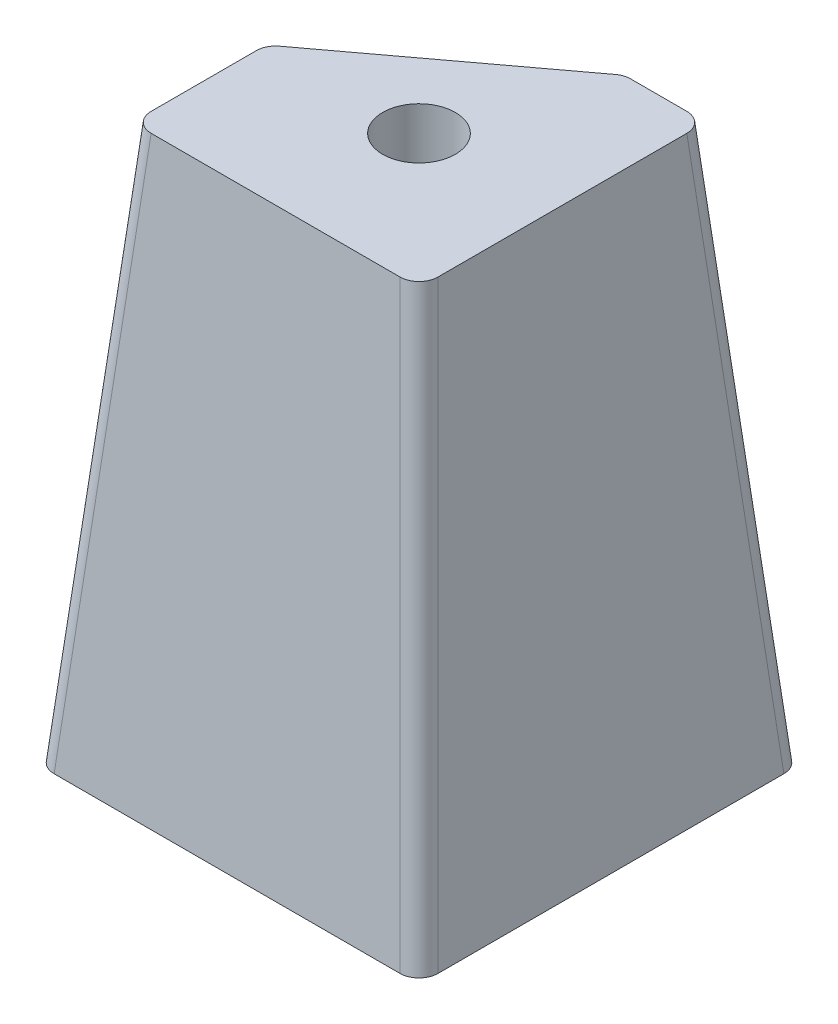
ISO-10303-21;
HEADER;
FILE_DESCRIPTION(('STEP AP214'),'2;1');
FILE_NAME('part.step','',(''),(''),'','','');
FILE_SCHEMA(('AUTOMOTIVE_DESIGN { 1 0 10303 214 1 1 1 1 }'));
ENDSEC;
DATA;
#1=APPLICATION_CONTEXT('core data for automotive mechanical design processes');
#2=APPLICATION_PROTOCOL_DEFINITION('international standard','automotive_design',2000,#1);
#3=PRODUCT_CONTEXT('',#1,'mechanical');
#4=PRODUCT('Part','Part','',(#3));
#5=PRODUCT_RELATED_PRODUCT_CATEGORY('part','',(#4));
#6=PRODUCT_DEFINITION_FORMATION('','',#4);
#7=PRODUCT_DEFINITION_CONTEXT('part definition',#1,'design');
#8=PRODUCT_DEFINITION('design','',#6,#7);
#9=PRODUCT_DEFINITION_SHAPE('','',#8);
#10=(LENGTH_UNIT() NAMED_UNIT(*) SI_UNIT(.MILLI.,.METRE.));
#11=(NAMED_UNIT(*) PLANE_ANGLE_UNIT() SI_UNIT($,.RADIAN.));
#12=(NAMED_UNIT(*) SI_UNIT($,.STERADIAN.) SOLID_ANGLE_UNIT());
#13=UNCERTAINTY_MEASURE_WITH_UNIT(LENGTH_MEASURE(1.E-05),#10,'distance_accuracy_value','');
#14=(GEOMETRIC_REPRESENTATION_CONTEXT(3) GLOBAL_UNCERTAINTY_ASSIGNED_CONTEXT((#13)) GLOBAL_UNIT_ASSIGNED_CONTEXT((#10,
#11,#12)) REPRESENTATION_CONTEXT('',''));
#15=CARTESIAN_POINT('',(0.,0.,0.));
#16=DIRECTION('',(0.,0.,1.));
#17=DIRECTION('',(1.,0.,0.));
#18=AXIS2_PLACEMENT_3D('',#15,#16,#17);
#19=CARTESIAN_POINT('',(-4.57964601769912,29.,7.20132743362832));
#20=DIRECTION('',(-0.996194698091746,0.0871557427476584,0.));
#21=DIRECTION('',(0.0871557427476584,0.996194698091746,0.));
#22=AXIS2_PLACEMENT_3D('',#19,#20,#21);
#23=PLANE('',#22);
#24=DIRECTION('',(0.,0.,1.));
#25=VECTOR('',#24,1.);
#26=CARTESIAN_POINT('',(-4.57964601769912,29.,7.20132743362832));
#27=LINE('',#26,#25);
#28=CARTESIAN_POINT('',(-4.57964601769912,29.,0.701272397167981));
#29=VERTEX_POINT('',#28);
#30=CARTESIAN_POINT('',(-4.57964601769912,29.,6.20513273553657));
#31=VERTEX_POINT('',#30);
#32=EDGE_CURVE('E152',#29,#31,#27,.T.);
#33=ORIENTED_EDGE('',*,*,#32,.F.);
#34=DIRECTION('',(0.0870724913818913,0.995243130626751,0.0436977366097345));
#35=VECTOR('',#34,1.);
#36=CARTESIAN_POINT('',(-4.55491414812916,29.2826865627297,0.713684201460962));
#37=LINE('',#36,#35);
#38=CARTESIAN_POINT('',(-7.11681725995092,0.,-0.572018844625635));
#39=VERTEX_POINT('',#38);
#40=EDGE_CURVE('E201',#29,#39,#37,.F.);
#41=ORIENTED_EDGE('',*,*,#40,.T.);
#42=DIRECTION('',(0.,0.,-1.));
#43=VECTOR('',#42,1.);
#44=CARTESIAN_POINT('',(-7.11681725995092,0.,0.));
#45=LINE('',#44,#43);
#46=CARTESIAN_POINT('',(-7.11681725995092,0.,8.74230397778837));
#47=VERTEX_POINT('',#46);
#48=EDGE_CURVE('E164',#39,#47,#45,.F.);
#49=ORIENTED_EDGE('',*,*,#48,.T.);
#50=DIRECTION('',(0.0868265938642478,0.992432509138967,-0.0868265938642478));
#51=VECTOR('',#50,1.);
#52=CARTESIAN_POINT('',(-4.58715618747273,28.914158366685,6.21264290531018));
#53=LINE('',#52,#51);
#54=EDGE_CURVE('E198',#47,#31,#53,.T.);
#55=ORIENTED_EDGE('',*,*,#54,.T.);
#56=EDGE_LOOP('',(#33,#41,#49,#55));
#57=FACE_BOUND('',#56,.T.);
#58=ADVANCED_FACE('F43',(#57),#23,.T.);
#59=CARTESIAN_POINT('',(10.4203539823009,29.,7.20132743362832));
#60=DIRECTION('',(0.,0.0871557427476584,0.996194698091746));
#61=DIRECTION('',(0.,0.996194698091746,-0.0871557427476584));
#62=AXIS2_PLACEMENT_3D('',#59,#60,#61);
#63=PLANE('',#62);
#64=DIRECTION('',(-1.,0.,0.));
#65=VECTOR('',#64,1.);
#66=CARTESIAN_POINT('',(0.,0.,9.73849867588012));
#67=LINE('',#66,#65);
#68=CARTESIAN_POINT('',(-6.12062256185918,0.,9.73849867588012));
#69=VERTEX_POINT('',#68);
#70=CARTESIAN_POINT('',(11.9613305264609,0.,9.73849867588012));
#71=VERTEX_POINT('',#70);
#72=EDGE_CURVE('E218',#69,#71,#67,.F.);
#73=ORIENTED_EDGE('',*,*,#72,.T.);
#74=DIRECTION('',(-0.0868265938642478,0.992432509138967,-0.0868265938642478));
#75=VECTOR('',#74,1.);
#76=CARTESIAN_POINT('',(9.43166945398275,28.914158366685,7.20883760340192));
#77=LINE('',#76,#75);
#78=CARTESIAN_POINT('',(9.42415928420914,29.,7.20132743362832));
#79=VERTEX_POINT('',#78);
#80=EDGE_CURVE('E11',#71,#79,#77,.T.);
#81=ORIENTED_EDGE('',*,*,#80,.T.);
#82=DIRECTION('',(1.,0.,0.));
#83=VECTOR('',#82,1.);
#84=CARTESIAN_POINT('',(10.4203539823009,29.,7.20132743362832));
#85=LINE('',#84,#83);
#86=CARTESIAN_POINT('',(-3.58345131960737,29.,7.20132743362832));
#87=VERTEX_POINT('',#86);
#88=EDGE_CURVE('E158',#87,#79,#85,.T.);
#89=ORIENTED_EDGE('',*,*,#88,.F.);
#90=DIRECTION('',(0.0868265938642478,0.992432509138967,-0.0868265938642478));
#91=VECTOR('',#90,1.);
#92=CARTESIAN_POINT('',(-3.47787862834998,30.2067013828153,7.09575474237092));
#93=LINE('',#92,#91);
#94=EDGE_CURVE('E55',#87,#69,#93,.F.);
#95=ORIENTED_EDGE('',*,*,#94,.T.);
#96=EDGE_LOOP('',(#73,#81,#89,#95));
#97=FACE_BOUND('',#96,.T.);
#98=ADVANCED_FACE('F220',(#97),#63,.T.);
#99=CARTESIAN_POINT('',(10.4203539823009,29.,-7.79867256637168));
#100=DIRECTION('',(0.996194698091746,0.0871557427476584,0.));
#101=DIRECTION('',(-0.0871557427476584,0.996194698091746,0.));
#102=AXIS2_PLACEMENT_3D('',#99,#100,#101);
#103=PLANE('',#102);
#104=DIRECTION('',(0.,0.,1.));
#105=VECTOR('',#104,1.);
#106=CARTESIAN_POINT('',(12.9575252245527,0.,0.));
#107=LINE('',#106,#105);
#108=CARTESIAN_POINT('',(12.9575252245527,0.,8.74230397778837));
#109=VERTEX_POINT('',#108);
#110=CARTESIAN_POINT('',(12.9575252245527,0.,-9.33964911053174));
#111=VERTEX_POINT('',#110);
#112=EDGE_CURVE('E163',#109,#111,#107,.F.);
#113=ORIENTED_EDGE('',*,*,#112,.T.);
#114=DIRECTION('',(-0.0868265938642478,0.992432509138967,0.0868265938642478));
#115=VECTOR('',#114,1.);
#116=CARTESIAN_POINT('',(10.4278641520745,28.914158366685,-6.80998803805355));
#117=LINE('',#116,#115);
#118=CARTESIAN_POINT('',(10.4203539823009,29.,-6.80247786827994));
#119=VERTEX_POINT('',#118);
#120=EDGE_CURVE('E56',#111,#119,#117,.T.);
#121=ORIENTED_EDGE('',*,*,#120,.T.);
#122=DIRECTION('',(0.,0.,-1.));
#123=VECTOR('',#122,1.);
#124=CARTESIAN_POINT('',(10.4203539823009,29.,-7.79867256637168));
#125=LINE('',#124,#123);
#126=CARTESIAN_POINT('',(10.4203539823009,29.,6.20513273553657));
#127=VERTEX_POINT('',#126);
#128=EDGE_CURVE('E232',#127,#119,#125,.T.);
#129=ORIENTED_EDGE('',*,*,#128,.F.);
#130=DIRECTION('',(-0.0868265938642478,0.992432509138967,-0.0868265938642478));
#131=VECTOR('',#130,1.);
#132=CARTESIAN_POINT('',(10.3147812910435,30.2067013828153,6.09956004427917));
#133=LINE('',#132,#131);
#134=EDGE_CURVE('E204',#127,#109,#133,.F.);
#135=ORIENTED_EDGE('',*,*,#134,.T.);
#136=EDGE_LOOP('',(#113,#121,#129,#135));
#137=FACE_BOUND('',#136,.T.);
#138=ADVANCED_FACE('F285',(#137),#103,.T.);
#139=CARTESIAN_POINT('',(6.15317736901956,29.,-7.79867256637168));
#140=DIRECTION('',(0.,0.0871557427476584,-0.996194698091746));
#141=DIRECTION('',(0.,0.996194698091746,0.0871557427476584));
#142=AXIS2_PLACEMENT_3D('',#139,#140,#141);
#143=PLANE('',#142);
#144=DIRECTION('',(1.,0.,0.));
#145=VECTOR('',#144,1.);
#146=CARTESIAN_POINT('',(0.,0.,-10.3358438086235));
#147=LINE('',#146,#145);
#148=CARTESIAN_POINT('',(11.9613305264609,0.,-10.3358438086235));
#149=VERTEX_POINT('',#148);
#150=CARTESIAN_POINT('',(5.64205583364326,0.,-10.3358438086235));
#151=VERTEX_POINT('',#150);
#152=EDGE_CURVE('E155',#149,#151,#147,.F.);
#153=ORIENTED_EDGE('',*,*,#152,.T.);
#154=DIRECTION('',(0.0288963352029625,0.995778700850393,0.087119347704982));
#155=VECTOR('',#154,1.);
#156=CARTESIAN_POINT('',(6.48332606858436,28.9904922451157,-7.79950438713965));
#157=LINE('',#156,#155);
#158=CARTESIAN_POINT('',(6.48360197252961,29.,-7.79867256637168));
#159=VERTEX_POINT('',#158);
#160=EDGE_CURVE('E130',#151,#159,#157,.T.);
#161=ORIENTED_EDGE('',*,*,#160,.T.);
#162=DIRECTION('',(-1.,0.,0.));
#163=VECTOR('',#162,1.);
#164=CARTESIAN_POINT('',(6.15317736901956,29.,-7.79867256637168));
#165=LINE('',#164,#163);
#166=CARTESIAN_POINT('',(9.42415928420914,29.,-7.79867256637168));
#167=VERTEX_POINT('',#166);
#168=EDGE_CURVE('E233',#167,#159,#165,.T.);
#169=ORIENTED_EDGE('',*,*,#168,.F.);
#170=DIRECTION('',(-0.0868265938642478,0.992432509138967,0.0868265938642478));
#171=VECTOR('',#170,1.);
#172=CARTESIAN_POINT('',(9.39949981798578,29.2818589886911,-7.77401310014833));
#173=LINE('',#172,#171);
#174=EDGE_CURVE('E133',#167,#149,#173,.F.);
#175=ORIENTED_EDGE('',*,*,#174,.T.);
#176=EDGE_LOOP('',(#153,#161,#169,#175));
#177=FACE_BOUND('',#176,.T.);
#178=ADVANCED_FACE('F276',(#177),#143,.T.);
#179=CARTESIAN_POINT('',(-4.57964601769912,29.,0.201327433628318));
#180=DIRECTION('',(-0.595351002863313,0.0871557427476584,-0.798724645854723));
#181=DIRECTION('',(0.0520864635693299,0.996194698091746,0.0698793517910468));
#182=AXIS2_PLACEMENT_3D('',#179,#180,#181);
#183=PLANE('',#182);
#184=DIRECTION('',(-0.801775644243755,0.,0.59762514697552));
#185=VECTOR('',#184,1.);
#186=CARTESIAN_POINT('',(-4.57964601769912,29.,0.201327433628318));
#187=LINE('',#186,#185);
#188=CARTESIAN_POINT('',(5.8882509696663,29.,-7.60120251413466));
#189=VERTEX_POINT('',#188);
#190=CARTESIAN_POINT('',(-4.17880232247069,29.,-0.0974522486867427));
#191=VERTEX_POINT('',#190);
#192=EDGE_CURVE('E141',#189,#191,#187,.T.);
#193=ORIENTED_EDGE('',*,*,#192,.F.);
#194=DIRECTION('',(0.0288963352029625,0.995778700850393,0.087119347704982));
#195=VECTOR('',#194,1.);
#196=CARTESIAN_POINT('',(5.89915261663084,29.3756749004757,-7.56833521917181));
#197=LINE('',#196,#195);
#198=CARTESIAN_POINT('',(5.04670483077995,0.,-10.1383737563865));
#199=VERTEX_POINT('',#198);
#200=EDGE_CURVE('E127',#189,#199,#197,.F.);
#201=ORIENTED_EDGE('',*,*,#200,.T.);
#202=DIRECTION('',(0.801775644243755,0.,-0.59762514697552));
#203=VECTOR('',#202,1.);
#204=CARTESIAN_POINT('',(-3.0554562361052,0.,-4.09920901849566));
#205=LINE('',#204,#203);
#206=CARTESIAN_POINT('',(-6.71597356472249,0.,-1.37074349048036));
#207=VERTEX_POINT('',#206);
#208=EDGE_CURVE('E139',#199,#207,#205,.F.);
#209=ORIENTED_EDGE('',*,*,#208,.T.);
#210=DIRECTION('',(0.0870724913818913,0.995243130626751,0.0436977366097345));
#211=VECTOR('',#210,1.);
#212=CARTESIAN_POINT('',(-4.18070454846125,28.9782574574362,-0.0984068896874585));
#213=LINE('',#212,#211);
#214=EDGE_CURVE('E147',#207,#191,#213,.T.);
#215=ORIENTED_EDGE('',*,*,#214,.T.);
#216=EDGE_LOOP('',(#193,#201,#209,#215));
#217=FACE_BOUND('',#216,.T.);
#218=ADVANCED_FACE('F137',(#217),#183,.T.);
#219=CARTESIAN_POINT('',(0.,29.,0.));
#220=DIRECTION('',(0.,-1.,0.));
#221=DIRECTION('',(0.,0.,-1.));
#222=AXIS2_PLACEMENT_3D('',#219,#220,#221);
#223=PLANE('',#222);
#224=CARTESIAN_POINT('',(3.42035398230088,29.,0.201327433628316));
#225=DIRECTION('',(0.,1.,0.));
#226=DIRECTION('',(0.,0.,1.));
#227=AXIS2_PLACEMENT_3D('',#224,#225,#226);
#228=CIRCLE('',#227,1.9);
#229=CARTESIAN_POINT('',(3.42035398230088,29.,2.10132743362832));
#230=VERTEX_POINT('',#229);
#231=EDGE_CURVE('E257',#230,#230,#228,.T.);
#232=ORIENTED_EDGE('',*,*,#231,.F.);
#233=EDGE_LOOP('',(#232));
#234=FACE_BOUND('',#233,.T.);
#235=ORIENTED_EDGE('',*,*,#168,.T.);
#236=CARTESIAN_POINT('',(6.48613113041896,29.,-6.79485272882834));
#237=DIRECTION('',(0.,-1.,0.));
#238=DIRECTION('',(-0.314820866332145,0.,-0.949151106053129));
#239=AXIS2_PLACEMENT_3D('',#236,#237,#238);
#240=ELLIPSE('',#239,1.00423919405587,1.);
#241=EDGE_CURVE('E193',#159,#189,#240,.F.);
#242=ORIENTED_EDGE('',*,*,#241,.T.);
#243=ORIENTED_EDGE('',*,*,#192,.T.);
#244=CARTESIAN_POINT('',(-3.57582618015577,29.,0.705099109027036));
#245=DIRECTION('',(0.,-1.,0.));
#246=DIRECTION('',(-0.893763152903363,0.,-0.448539214018396));
#247=AXIS2_PLACEMENT_3D('',#244,#245,#246);
#248=ELLIPSE('',#247,1.00477960533147,1.);
#249=EDGE_CURVE('E195',#191,#29,#248,.F.);
#250=ORIENTED_EDGE('',*,*,#249,.T.);
#251=ORIENTED_EDGE('',*,*,#32,.T.);
#252=CARTESIAN_POINT('',(-3.57582618015577,29.,6.19750759608497));
#253=DIRECTION('',(0.,-1.,0.));
#254=DIRECTION('',(-0.707106781186548,0.,0.707106781186548));
#255=AXIS2_PLACEMENT_3D('',#252,#253,#254);
#256=ELLIPSE('',#255,1.00762519445035,1.);
#257=EDGE_CURVE('E183',#31,#87,#256,.F.);
#258=ORIENTED_EDGE('',*,*,#257,.T.);
#259=ORIENTED_EDGE('',*,*,#88,.T.);
#260=CARTESIAN_POINT('',(9.41653414475753,29.,6.19750759608497));
#261=DIRECTION('',(0.,-1.,0.));
#262=DIRECTION('',(0.707106781186548,0.,0.707106781186548));
#263=AXIS2_PLACEMENT_3D('',#260,#261,#262);
#264=ELLIPSE('',#263,1.00762519445035,1.);
#265=EDGE_CURVE('E67',#79,#127,#264,.F.);
#266=ORIENTED_EDGE('',*,*,#265,.T.);
#267=ORIENTED_EDGE('',*,*,#128,.T.);
#268=CARTESIAN_POINT('',(9.41653414475753,29.,-6.79485272882834));
#269=DIRECTION('',(0.,-1.,0.));
#270=DIRECTION('',(0.707106781186548,0.,-0.707106781186548));
#271=AXIS2_PLACEMENT_3D('',#268,#269,#270);
#272=ELLIPSE('',#271,1.00762519445035,1.);
#273=EDGE_CURVE('E186',#119,#167,#272,.F.);
#274=ORIENTED_EDGE('',*,*,#273,.T.);
#275=EDGE_LOOP('',(#235,#242,#243,#250,#251,#258,#259,#266,#267,#274));
#276=FACE_BOUND('',#275,.T.);
#277=ADVANCED_FACE('F275',(#234,#276),#223,.F.);
#278=CARTESIAN_POINT('',(0.,0.,0.));
#279=DIRECTION('',(0.,-1.,0.));
#280=DIRECTION('',(0.,0.,-1.));
#281=AXIS2_PLACEMENT_3D('',#278,#279,#280);
#282=PLANE('',#281);
#283=CARTESIAN_POINT('',(-0.579646017699118,0.,2.20132743362832));
#284=DIRECTION('',(0.,-1.,0.));
#285=DIRECTION('',(0.,0.,-1.));
#286=AXIS2_PLACEMENT_3D('',#283,#284,#285);
#287=CIRCLE('',#286,1.5);
#288=CARTESIAN_POINT('',(-0.579646017699118,0.,0.701327433628316));
#289=VERTEX_POINT('',#288);
#290=EDGE_CURVE('E248',#289,#289,#287,.T.);
#291=ORIENTED_EDGE('',*,*,#290,.F.);
#292=EDGE_LOOP('',(#291));
#293=FACE_BOUND('',#292,.T.);
#294=CARTESIAN_POINT('',(7.42035398230088,0.,2.20132743362832));
#295=DIRECTION('',(0.,-1.,0.));
#296=DIRECTION('',(0.,0.,-1.));
#297=AXIS2_PLACEMENT_3D('',#294,#295,#296);
#298=CIRCLE('',#297,2.);
#299=CARTESIAN_POINT('',(7.42035398230088,0.,0.201327433628316));
#300=VERTEX_POINT('',#299);
#301=EDGE_CURVE('E242',#300,#300,#298,.T.);
#302=ORIENTED_EDGE('',*,*,#301,.F.);
#303=EDGE_LOOP('',(#302));
#304=FACE_BOUND('',#303,.T.);
#305=ORIENTED_EDGE('',*,*,#208,.F.);
#306=CARTESIAN_POINT('',(5.64458499153261,0.,-9.33202397108014));
#307=DIRECTION('',(0.,-1.,0.));
#308=DIRECTION('',(-0.314820866332145,0.,-0.949151106053129));
#309=AXIS2_PLACEMENT_3D('',#306,#307,#308);
#310=ELLIPSE('',#309,1.00423919405587,1.);
#311=EDGE_CURVE('E125',#199,#151,#310,.T.);
#312=ORIENTED_EDGE('',*,*,#311,.T.);
#313=ORIENTED_EDGE('',*,*,#152,.F.);
#314=CARTESIAN_POINT('',(11.9537053870093,0.,-9.33202397108014));
#315=DIRECTION('',(0.,-1.,0.));
#316=DIRECTION('',(0.707106781186548,0.,-0.707106781186548));
#317=AXIS2_PLACEMENT_3D('',#314,#315,#316);
#318=ELLIPSE('',#317,1.00762519445035,1.);
#319=EDGE_CURVE('E172',#149,#111,#318,.T.);
#320=ORIENTED_EDGE('',*,*,#319,.T.);
#321=ORIENTED_EDGE('',*,*,#112,.F.);
#322=CARTESIAN_POINT('',(11.9537053870093,0.,8.73467883833677));
#323=DIRECTION('',(0.,-1.,0.));
#324=DIRECTION('',(0.707106781186548,0.,0.707106781186548));
#325=AXIS2_PLACEMENT_3D('',#322,#323,#324);
#326=ELLIPSE('',#325,1.00762519445035,1.);
#327=EDGE_CURVE('E171',#109,#71,#326,.T.);
#328=ORIENTED_EDGE('',*,*,#327,.T.);
#329=ORIENTED_EDGE('',*,*,#72,.F.);
#330=CARTESIAN_POINT('',(-6.11299742240757,0.,8.73467883833677));
#331=DIRECTION('',(0.,-1.,0.));
#332=DIRECTION('',(-0.707106781186548,0.,0.707106781186548));
#333=AXIS2_PLACEMENT_3D('',#330,#331,#332);
#334=ELLIPSE('',#333,1.00762519445035,1.);
#335=EDGE_CURVE('E143',#69,#47,#334,.T.);
#336=ORIENTED_EDGE('',*,*,#335,.T.);
#337=ORIENTED_EDGE('',*,*,#48,.F.);
#338=CARTESIAN_POINT('',(-6.11299742240757,0.,-0.568192132766579));
#339=DIRECTION('',(0.,-1.,0.));
#340=DIRECTION('',(-0.893763152903363,0.,-0.448539214018396));
#341=AXIS2_PLACEMENT_3D('',#338,#339,#340);
#342=ELLIPSE('',#341,1.00477960533147,1.);
#343=EDGE_CURVE('E134',#39,#207,#342,.T.);
#344=ORIENTED_EDGE('',*,*,#343,.T.);
#345=EDGE_LOOP('',(#305,#312,#313,#320,#321,#328,#329,#336,#337,#344));
#346=FACE_BOUND('',#345,.T.);
#347=ADVANCED_FACE('F149',(#293,#304,#346),#282,.T.);
#348=CARTESIAN_POINT('',(7.42035398230088,10.,2.20132743362832));
#349=DIRECTION('',(0.,-1.,0.));
#350=DIRECTION('',(0.,0.,-1.));
#351=AXIS2_PLACEMENT_3D('',#348,#349,#350);
#352=CYLINDRICAL_SURFACE('',#351,2.);
#353=CARTESIAN_POINT('',(7.42035398230088,10.,2.20132743362832));
#354=DIRECTION('',(0.,-1.,0.));
#355=DIRECTION('',(0.,0.,-1.));
#356=AXIS2_PLACEMENT_3D('',#353,#354,#355);
#357=CIRCLE('',#356,2.);
#358=CARTESIAN_POINT('',(7.42035398230088,10.,0.201327433628316));
#359=VERTEX_POINT('',#358);
#360=EDGE_CURVE('E239',#359,#359,#357,.T.);
#361=ORIENTED_EDGE('',*,*,#360,.F.);
#362=EDGE_LOOP('',(#361));
#363=FACE_BOUND('',#362,.T.);
#364=ORIENTED_EDGE('',*,*,#301,.T.);
#365=EDGE_LOOP('',(#364));
#366=FACE_BOUND('',#365,.T.);
#367=ADVANCED_FACE('F314',(#363,#366),#352,.F.);
#368=CARTESIAN_POINT('',(7.42035398230088,10.,2.20132743362832));
#369=DIRECTION('',(0.,-1.,0.));
#370=DIRECTION('',(0.,0.,-1.));
#371=AXIS2_PLACEMENT_3D('',#368,#369,#370);
#372=PLANE('',#371);
#373=ORIENTED_EDGE('',*,*,#360,.T.);
#374=EDGE_LOOP('',(#373));
#375=FACE_BOUND('',#374,.T.);
#376=ADVANCED_FACE('F319',(#375),#372,.T.);
#377=CARTESIAN_POINT('',(-0.579646017699118,10.,2.20132743362832));
#378=DIRECTION('',(0.,-1.,0.));
#379=DIRECTION('',(0.,0.,-1.));
#380=AXIS2_PLACEMENT_3D('',#377,#378,#379);
#381=CYLINDRICAL_SURFACE('',#380,1.5);
#382=CARTESIAN_POINT('',(-0.579646017699118,10.,2.20132743362832));
#383=DIRECTION('',(0.,-1.,0.));
#384=DIRECTION('',(0.,0.,-1.));
#385=AXIS2_PLACEMENT_3D('',#382,#383,#384);
#386=CIRCLE('',#385,1.5);
#387=CARTESIAN_POINT('',(-0.579646017699118,10.,0.701327433628316));
#388=VERTEX_POINT('',#387);
#389=EDGE_CURVE('E227',#388,#388,#386,.T.);
#390=ORIENTED_EDGE('',*,*,#389,.F.);
#391=EDGE_LOOP('',(#390));
#392=FACE_BOUND('',#391,.T.);
#393=ORIENTED_EDGE('',*,*,#290,.T.);
#394=EDGE_LOOP('',(#393));
#395=FACE_BOUND('',#394,.T.);
#396=ADVANCED_FACE('F322',(#392,#395),#381,.F.);
#397=CARTESIAN_POINT('',(-0.579646017699118,10.,2.20132743362832));
#398=DIRECTION('',(0.,-1.,0.));
#399=DIRECTION('',(0.,0.,-1.));
#400=AXIS2_PLACEMENT_3D('',#397,#398,#399);
#401=PLANE('',#400);
#402=ORIENTED_EDGE('',*,*,#389,.T.);
#403=EDGE_LOOP('',(#402));
#404=FACE_BOUND('',#403,.T.);
#405=ADVANCED_FACE('F268',(#404),#401,.T.);
#406=CARTESIAN_POINT('',(3.42035398230088,23.,0.201327433628316));
#407=DIRECTION('',(0.,1.,0.));
#408=DIRECTION('',(0.,0.,1.));
#409=AXIS2_PLACEMENT_3D('',#406,#407,#408);
#410=CYLINDRICAL_SURFACE('',#409,1.9);
#411=CARTESIAN_POINT('',(3.42035398230088,23.,0.201327433628316));
#412=DIRECTION('',(0.,1.,0.));
#413=DIRECTION('',(0.,0.,1.));
#414=AXIS2_PLACEMENT_3D('',#411,#412,#413);
#415=CIRCLE('',#414,1.9);
#416=CARTESIAN_POINT('',(3.42035398230088,23.,2.10132743362832));
#417=VERTEX_POINT('',#416);
#418=EDGE_CURVE('E244',#417,#417,#415,.T.);
#419=ORIENTED_EDGE('',*,*,#418,.F.);
#420=EDGE_LOOP('',(#419));
#421=FACE_BOUND('',#420,.T.);
#422=ORIENTED_EDGE('',*,*,#231,.T.);
#423=EDGE_LOOP('',(#422));
#424=FACE_BOUND('',#423,.T.);
#425=ADVANCED_FACE('F261',(#421,#424),#410,.F.);
#426=CARTESIAN_POINT('',(3.42035398230088,23.,0.201327433628316));
#427=DIRECTION('',(0.,1.,0.));
#428=DIRECTION('',(0.,0.,1.));
#429=AXIS2_PLACEMENT_3D('',#426,#427,#428);
#430=PLANE('',#429);
#431=ORIENTED_EDGE('',*,*,#418,.T.);
#432=EDGE_LOOP('',(#431));
#433=FACE_BOUND('',#432,.T.);
#434=ADVANCED_FACE('F263',(#433),#430,.T.);
#435=CARTESIAN_POINT('',(6.49450361949416,29.288519157728,-6.76961057331709));
#436=DIRECTION('',(-0.0288963352029625,-0.995778700850393,-0.087119347704982));
#437=DIRECTION('',(0.,0.0871557427476583,-0.996194698091745));
#438=AXIS2_PLACEMENT_3D('',#435,#436,#437);
#439=CYLINDRICAL_SURFACE('',#438,1.);
#440=ORIENTED_EDGE('',*,*,#241,.F.);
#441=ORIENTED_EDGE('',*,*,#160,.F.);
#442=ORIENTED_EDGE('',*,*,#311,.F.);
#443=ORIENTED_EDGE('',*,*,#200,.F.);
#444=EDGE_LOOP('',(#440,#441,#442,#443));
#445=FACE_BOUND('',#444,.T.);
#446=ADVANCED_FACE('F123',(#445),#439,.T.);
#447=CARTESIAN_POINT('',(-3.55871945003742,29.195530819982,0.713684201460961));
#448=DIRECTION('',(-0.0870724913818913,-0.995243130626751,-0.0436977366097345));
#449=DIRECTION('',(0.996194698091745,-0.0871557427476583,0.));
#450=AXIS2_PLACEMENT_3D('',#447,#448,#449);
#451=CYLINDRICAL_SURFACE('',#450,1.);
#452=ORIENTED_EDGE('',*,*,#249,.F.);
#453=ORIENTED_EDGE('',*,*,#214,.F.);
#454=ORIENTED_EDGE('',*,*,#343,.F.);
#455=ORIENTED_EDGE('',*,*,#40,.F.);
#456=EDGE_LOOP('',(#452,#453,#454,#455));
#457=FACE_BOUND('',#456,.T.);
#458=ADVANCED_FACE('F292',(#457),#451,.T.);
#459=CARTESIAN_POINT('',(9.39949981798578,29.1947032459435,-6.77781840205658));
#460=DIRECTION('',(0.0868265938642478,-0.992432509138967,-0.0868265938642478));
#461=DIRECTION('',(0.,0.0871557427476584,-0.996194698091746));
#462=AXIS2_PLACEMENT_3D('',#459,#460,#461);
#463=CYLINDRICAL_SURFACE('',#462,1.);
#464=ORIENTED_EDGE('',*,*,#273,.F.);
#465=ORIENTED_EDGE('',*,*,#120,.F.);
#466=ORIENTED_EDGE('',*,*,#319,.F.);
#467=ORIENTED_EDGE('',*,*,#174,.F.);
#468=EDGE_LOOP('',(#464,#465,#466,#467));
#469=FACE_BOUND('',#468,.T.);
#470=ADVANCED_FACE('F282',(#469),#463,.T.);
#471=CARTESIAN_POINT('',(9.31858659295174,30.1195456400677,6.09956004427917));
#472=DIRECTION('',(0.0868265938642478,-0.992432509138967,0.0868265938642478));
#473=DIRECTION('',(0.,-0.0871557427476584,-0.996194698091746));
#474=AXIS2_PLACEMENT_3D('',#471,#472,#473);
#475=CYLINDRICAL_SURFACE('',#474,1.);
#476=ORIENTED_EDGE('',*,*,#265,.F.);
#477=ORIENTED_EDGE('',*,*,#80,.F.);
#478=ORIENTED_EDGE('',*,*,#327,.F.);
#479=ORIENTED_EDGE('',*,*,#134,.F.);
#480=EDGE_LOOP('',(#476,#477,#478,#479));
#481=FACE_BOUND('',#480,.T.);
#482=ADVANCED_FACE('F281',(#481),#475,.T.);
#483=CARTESIAN_POINT('',(-3.47787862834998,30.1195456400677,6.09956004427917));
#484=DIRECTION('',(-0.0868265938642478,-0.992432509138967,0.0868265938642478));
#485=DIRECTION('',(0.,-0.0871557427476584,-0.996194698091746));
#486=AXIS2_PLACEMENT_3D('',#483,#484,#485);
#487=CYLINDRICAL_SURFACE('',#486,1.);
#488=ORIENTED_EDGE('',*,*,#257,.F.);
#489=ORIENTED_EDGE('',*,*,#54,.F.);
#490=ORIENTED_EDGE('',*,*,#335,.F.);
#491=ORIENTED_EDGE('',*,*,#94,.F.);
#492=EDGE_LOOP('',(#488,#489,#490,#491));
#493=FACE_BOUND('',#492,.T.);
#494=ADVANCED_FACE('F44',(#493),#487,.T.);
#495=CLOSED_SHELL('',(#58,#98,#138,#178,#218,#277,#347,#367,#376,#396,#405,#425,#434,#446,#458,
#470,#482,#494));
#496=MANIFOLD_SOLID_BREP('B2',#495);
#497=ADVANCED_BREP_SHAPE_REPRESENTATION('',(#18,#496),#14);
#498=SHAPE_DEFINITION_REPRESENTATION(#9,#497);
ENDSEC;
END-ISO-10303-21;
